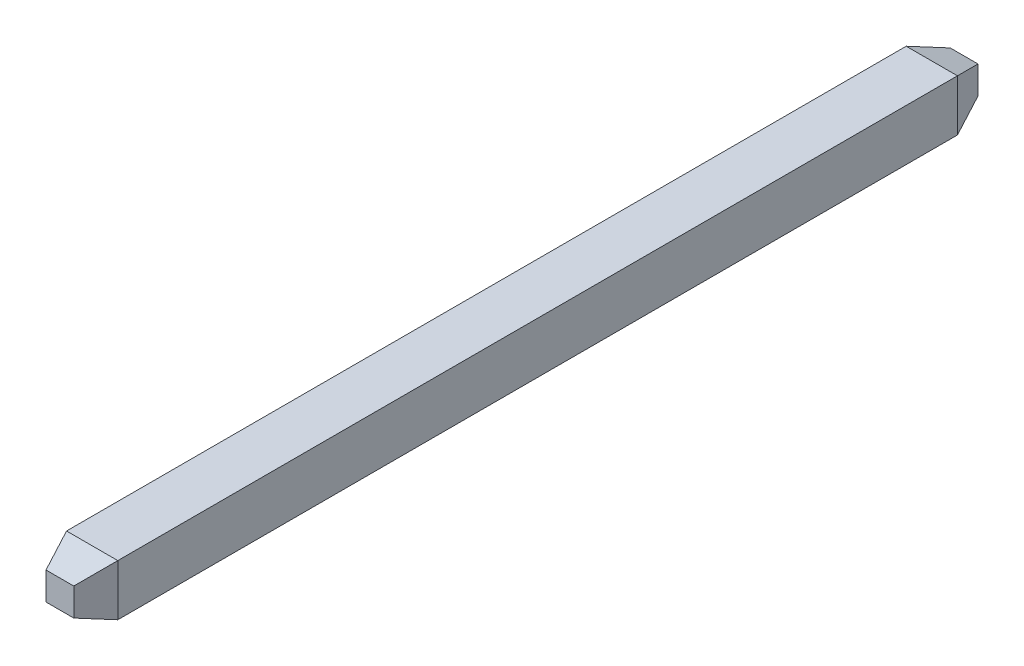
ISO-10303-21;
HEADER;
FILE_DESCRIPTION(('STEP AP214'),'2;1');
FILE_NAME('part.step','',(''),(''),'','','');
FILE_SCHEMA(('AUTOMOTIVE_DESIGN { 1 0 10303 214 1 1 1 1 }'));
ENDSEC;
DATA;
#1=APPLICATION_CONTEXT('core data for automotive mechanical design processes');
#2=APPLICATION_PROTOCOL_DEFINITION('international standard','automotive_design',2000,#1);
#3=PRODUCT_CONTEXT('',#1,'mechanical');
#4=PRODUCT('Part','Part','',(#3));
#5=PRODUCT_RELATED_PRODUCT_CATEGORY('part','',(#4));
#6=PRODUCT_DEFINITION_FORMATION('','',#4);
#7=PRODUCT_DEFINITION_CONTEXT('part definition',#1,'design');
#8=PRODUCT_DEFINITION('design','',#6,#7);
#9=PRODUCT_DEFINITION_SHAPE('','',#8);
#10=(LENGTH_UNIT() NAMED_UNIT(*) SI_UNIT(.MILLI.,.METRE.));
#11=(NAMED_UNIT(*) PLANE_ANGLE_UNIT() SI_UNIT($,.RADIAN.));
#12=(NAMED_UNIT(*) SI_UNIT($,.STERADIAN.) SOLID_ANGLE_UNIT());
#13=UNCERTAINTY_MEASURE_WITH_UNIT(LENGTH_MEASURE(1.E-05),#10,'distance_accuracy_value','');
#14=(GEOMETRIC_REPRESENTATION_CONTEXT(3) GLOBAL_UNCERTAINTY_ASSIGNED_CONTEXT((#13)) GLOBAL_UNIT_ASSIGNED_CONTEXT((#10,
#11,#12)) REPRESENTATION_CONTEXT('',''));
#15=CARTESIAN_POINT('',(0.,0.,0.));
#16=DIRECTION('',(0.,0.,1.));
#17=DIRECTION('',(1.,0.,0.));
#18=AXIS2_PLACEMENT_3D('',#15,#16,#17);
#19=CARTESIAN_POINT('',(0.171911906294,0.3175,2.6));
#20=DIRECTION('',(-0.939692620785813,0.,-0.342020143325932));
#21=DIRECTION('',(-0.342020143325932,0.,0.939692620785813));
#22=AXIS2_PLACEMENT_3D('',#19,#20,#21);
#23=PLANE('',#22);
#24=DIRECTION('',(0.,-1.,0.));
#25=VECTOR('',#24,1.);
#26=CARTESIAN_POINT('',(0.3175,-0.3175,2.2));
#27=LINE('',#26,#25);
#28=CARTESIAN_POINT('',(0.317500000000268,-0.317500000000134,2.20000000000015));
#29=VERTEX_POINT('',#28);
#30=CARTESIAN_POINT('',(0.317500000000268,0.317500000000134,2.20000000000015));
#31=VERTEX_POINT('',#30);
#32=EDGE_CURVE('E117',#29,#31,#27,.F.);
#33=ORIENTED_EDGE('',*,*,#32,.T.);
#34=DIRECTION('',(-0.323615577117339,-0.323615577118532,0.889126490716169));
#35=VECTOR('',#34,1.);
#36=CARTESIAN_POINT('',(0.3175,0.317500000000537,2.2000000000002));
#37=LINE('',#36,#35);
#38=CARTESIAN_POINT('',(0.171911906294,0.171911906294,2.6));
#39=VERTEX_POINT('',#38);
#40=EDGE_CURVE('E88',#31,#39,#37,.T.);
#41=ORIENTED_EDGE('',*,*,#40,.T.);
#42=DIRECTION('',(0.,1.,0.));
#43=VECTOR('',#42,1.);
#44=CARTESIAN_POINT('',(0.171911906294,0.3175,2.6));
#45=LINE('',#44,#43);
#46=CARTESIAN_POINT('',(0.171911906294,-0.171911906294,2.6));
#47=VERTEX_POINT('',#46);
#48=EDGE_CURVE('E19',#39,#47,#45,.F.);
#49=ORIENTED_EDGE('',*,*,#48,.T.);
#50=DIRECTION('',(0.323615577117339,-0.323615577118532,-0.889126490716169));
#51=VECTOR('',#50,1.);
#52=CARTESIAN_POINT('',(0.171911906294,-0.171911906294,2.6));
#53=LINE('',#52,#51);
#54=EDGE_CURVE('E86',#47,#29,#53,.T.);
#55=ORIENTED_EDGE('',*,*,#54,.T.);
#56=EDGE_LOOP('',(#33,#41,#49,#55));
#57=FACE_BOUND('',#56,.T.);
#58=ADVANCED_FACE('F16',(#57),#23,.F.);
#59=CARTESIAN_POINT('',(0.3175,-0.3175,-8.2));
#60=DIRECTION('',(0.939692620785813,0.,-0.342020143325932));
#61=DIRECTION('',(-0.342020143325932,0.,-0.939692620785813));
#62=AXIS2_PLACEMENT_3D('',#59,#60,#61);
#63=PLANE('',#62);
#64=DIRECTION('',(-0.323615577117339,-0.323615577118533,-0.889126490716169));
#65=VECTOR('',#64,1.);
#66=CARTESIAN_POINT('',(0.3175,0.3175,-8.2));
#67=LINE('',#66,#65);
#68=CARTESIAN_POINT('',(0.3175,0.3175,-8.2));
#69=VERTEX_POINT('',#68);
#70=CARTESIAN_POINT('',(0.171911906293732,0.171911906293866,-8.59999999999985));
#71=VERTEX_POINT('',#70);
#72=EDGE_CURVE('E113',#69,#71,#67,.T.);
#73=ORIENTED_EDGE('',*,*,#72,.F.);
#74=DIRECTION('',(0.,-1.,0.));
#75=VECTOR('',#74,1.);
#76=CARTESIAN_POINT('',(0.3175,-0.3175,-8.2));
#77=LINE('',#76,#75);
#78=CARTESIAN_POINT('',(0.3175,-0.3175,-8.2));
#79=VERTEX_POINT('',#78);
#80=EDGE_CURVE('E119',#69,#79,#77,.T.);
#81=ORIENTED_EDGE('',*,*,#80,.T.);
#82=DIRECTION('',(0.323615577117339,-0.323615577118533,0.889126490716169));
#83=VECTOR('',#82,1.);
#84=CARTESIAN_POINT('',(0.171911906294,-0.171911906293463,-8.5999999999998));
#85=LINE('',#84,#83);
#86=CARTESIAN_POINT('',(0.171911906293732,-0.171911906293866,-8.59999999999985));
#87=VERTEX_POINT('',#86);
#88=EDGE_CURVE('E100',#87,#79,#85,.T.);
#89=ORIENTED_EDGE('',*,*,#88,.F.);
#90=DIRECTION('',(0.,1.,0.));
#91=VECTOR('',#90,1.);
#92=CARTESIAN_POINT('',(0.171911906294,0.3175,-8.6));
#93=LINE('',#92,#91);
#94=EDGE_CURVE('E78',#71,#87,#93,.F.);
#95=ORIENTED_EDGE('',*,*,#94,.F.);
#96=EDGE_LOOP('',(#73,#81,#89,#95));
#97=FACE_BOUND('',#96,.T.);
#98=ADVANCED_FACE('F210',(#97),#63,.T.);
#99=CARTESIAN_POINT('',(-0.3175,0.3175,2.6));
#100=DIRECTION('',(0.,0.,-1.));
#101=DIRECTION('',(-1.,0.,0.));
#102=AXIS2_PLACEMENT_3D('',#99,#100,#101);
#103=PLANE('',#102);
#104=ORIENTED_EDGE('',*,*,#48,.F.);
#105=DIRECTION('',(1.,0.,0.));
#106=VECTOR('',#105,1.);
#107=CARTESIAN_POINT('',(-0.3175,0.171911906294,2.6));
#108=LINE('',#107,#106);
#109=CARTESIAN_POINT('',(-0.171911906294,0.171911906294,2.6));
#110=VERTEX_POINT('',#109);
#111=EDGE_CURVE('E111',#39,#110,#108,.F.);
#112=ORIENTED_EDGE('',*,*,#111,.T.);
#113=DIRECTION('',(0.,1.,0.));
#114=VECTOR('',#113,1.);
#115=CARTESIAN_POINT('',(-0.171911906294,0.3175,2.6));
#116=LINE('',#115,#114);
#117=CARTESIAN_POINT('',(-0.171911906294,-0.171911906294,2.6));
#118=VERTEX_POINT('',#117);
#119=EDGE_CURVE('E104',#110,#118,#116,.F.);
#120=ORIENTED_EDGE('',*,*,#119,.T.);
#121=DIRECTION('',(1.,0.,0.));
#122=VECTOR('',#121,1.);
#123=CARTESIAN_POINT('',(-0.3175,-0.171911906294,2.6));
#124=LINE('',#123,#122);
#125=EDGE_CURVE('E93',#118,#47,#124,.T.);
#126=ORIENTED_EDGE('',*,*,#125,.T.);
#127=EDGE_LOOP('',(#104,#112,#120,#126));
#128=FACE_BOUND('',#127,.T.);
#129=ADVANCED_FACE('F103',(#128),#103,.F.);
#130=CARTESIAN_POINT('',(-0.3175,-0.171911906294,2.6));
#131=DIRECTION('',(0.,0.939692620785813,-0.342020143325932));
#132=DIRECTION('',(0.,0.342020143325932,0.939692620785813));
#133=AXIS2_PLACEMENT_3D('',#130,#131,#132);
#134=PLANE('',#133);
#135=DIRECTION('',(1.,0.,0.));
#136=VECTOR('',#135,1.);
#137=CARTESIAN_POINT('',(-0.3175,-0.3175,2.2));
#138=LINE('',#137,#136);
#139=CARTESIAN_POINT('',(-0.317500000000134,-0.317500000000268,2.20000000000015));
#140=VERTEX_POINT('',#139);
#141=EDGE_CURVE('E99',#140,#29,#138,.T.);
#142=ORIENTED_EDGE('',*,*,#141,.T.);
#143=ORIENTED_EDGE('',*,*,#54,.F.);
#144=ORIENTED_EDGE('',*,*,#125,.F.);
#145=DIRECTION('',(-0.323615577118532,-0.323615577117339,-0.889126490716169));
#146=VECTOR('',#145,1.);
#147=CARTESIAN_POINT('',(-0.171911906294,-0.171911906294,2.6));
#148=LINE('',#147,#146);
#149=EDGE_CURVE('E123',#118,#140,#148,.T.);
#150=ORIENTED_EDGE('',*,*,#149,.T.);
#151=EDGE_LOOP('',(#142,#143,#144,#150));
#152=FACE_BOUND('',#151,.T.);
#153=ADVANCED_FACE('F96',(#152),#134,.F.);
#154=CARTESIAN_POINT('',(-0.3175,-0.3175,-8.2));
#155=DIRECTION('',(0.,-0.939692620785813,-0.342020143325932));
#156=DIRECTION('',(0.,0.342020143325932,-0.939692620785813));
#157=AXIS2_PLACEMENT_3D('',#154,#155,#156);
#158=PLANE('',#157);
#159=ORIENTED_EDGE('',*,*,#88,.T.);
#160=DIRECTION('',(1.,0.,0.));
#161=VECTOR('',#160,1.);
#162=CARTESIAN_POINT('',(-0.3175,-0.3175,-8.2));
#163=LINE('',#162,#161);
#164=CARTESIAN_POINT('',(-0.3175,-0.3175,-8.2));
#165=VERTEX_POINT('',#164);
#166=EDGE_CURVE('E132',#79,#165,#163,.F.);
#167=ORIENTED_EDGE('',*,*,#166,.T.);
#168=DIRECTION('',(-0.323615577118533,-0.323615577117339,0.889126490716169));
#169=VECTOR('',#168,1.);
#170=CARTESIAN_POINT('',(-0.171911906293463,-0.171911906294,-8.5999999999998));
#171=LINE('',#170,#169);
#172=CARTESIAN_POINT('',(-0.171911906293866,-0.171911906293732,-8.59999999999985));
#173=VERTEX_POINT('',#172);
#174=EDGE_CURVE('E135',#173,#165,#171,.T.);
#175=ORIENTED_EDGE('',*,*,#174,.F.);
#176=DIRECTION('',(-1.,0.,0.));
#177=VECTOR('',#176,1.);
#178=CARTESIAN_POINT('',(-0.3175,-0.171911906294,-8.6));
#179=LINE('',#178,#177);
#180=EDGE_CURVE('E108',#87,#173,#179,.T.);
#181=ORIENTED_EDGE('',*,*,#180,.F.);
#182=EDGE_LOOP('',(#159,#167,#175,#181));
#183=FACE_BOUND('',#182,.T.);
#184=ADVANCED_FACE('F203',(#183),#158,.T.);
#185=CARTESIAN_POINT('',(-0.3175,0.3175,-8.6));
#186=DIRECTION('',(0.,0.,-1.));
#187=DIRECTION('',(-1.,0.,0.));
#188=AXIS2_PLACEMENT_3D('',#185,#186,#187);
#189=PLANE('',#188);
#190=ORIENTED_EDGE('',*,*,#94,.T.);
#191=ORIENTED_EDGE('',*,*,#180,.T.);
#192=DIRECTION('',(0.,1.,0.));
#193=VECTOR('',#192,1.);
#194=CARTESIAN_POINT('',(-0.171911906293463,-0.3175,-8.5999999999998));
#195=LINE('',#194,#193);
#196=CARTESIAN_POINT('',(-0.171911906293866,0.171911906293732,-8.59999999999985));
#197=VERTEX_POINT('',#196);
#198=EDGE_CURVE('E140',#197,#173,#195,.F.);
#199=ORIENTED_EDGE('',*,*,#198,.F.);
#200=DIRECTION('',(1.,0.,0.));
#201=VECTOR('',#200,1.);
#202=CARTESIAN_POINT('',(-0.3175,0.171911906293463,-8.5999999999998));
#203=LINE('',#202,#201);
#204=EDGE_CURVE('E115',#71,#197,#203,.F.);
#205=ORIENTED_EDGE('',*,*,#204,.F.);
#206=EDGE_LOOP('',(#190,#191,#199,#205));
#207=FACE_BOUND('',#206,.T.);
#208=ADVANCED_FACE('F200',(#207),#189,.T.);
#209=CARTESIAN_POINT('',(-0.3175,0.171911906294,2.6));
#210=DIRECTION('',(0.,-0.939692620785813,-0.342020143325932));
#211=DIRECTION('',(0.,0.342020143325932,-0.939692620785813));
#212=AXIS2_PLACEMENT_3D('',#209,#210,#211);
#213=PLANE('',#212);
#214=ORIENTED_EDGE('',*,*,#111,.F.);
#215=ORIENTED_EDGE('',*,*,#40,.F.);
#216=DIRECTION('',(1.,0.,0.));
#217=VECTOR('',#216,1.);
#218=CARTESIAN_POINT('',(-0.3175,0.3175,2.2));
#219=LINE('',#218,#217);
#220=CARTESIAN_POINT('',(-0.317500000000134,0.317500000000268,2.20000000000015));
#221=VERTEX_POINT('',#220);
#222=EDGE_CURVE('E143',#31,#221,#219,.F.);
#223=ORIENTED_EDGE('',*,*,#222,.T.);
#224=DIRECTION('',(0.323615577118533,-0.32361557711734,0.889126490716169));
#225=VECTOR('',#224,1.);
#226=CARTESIAN_POINT('',(-0.317500000000537,0.3175,2.2000000000002));
#227=LINE('',#226,#225);
#228=EDGE_CURVE('E125',#221,#110,#227,.T.);
#229=ORIENTED_EDGE('',*,*,#228,.T.);
#230=EDGE_LOOP('',(#214,#215,#223,#229));
#231=FACE_BOUND('',#230,.T.);
#232=ADVANCED_FACE('F174',(#231),#213,.F.);
#233=CARTESIAN_POINT('',(-0.3175,0.3175,-8.2));
#234=DIRECTION('',(0.,0.939692620785813,-0.342020143325932));
#235=DIRECTION('',(0.,0.342020143325932,0.939692620785813));
#236=AXIS2_PLACEMENT_3D('',#233,#234,#235);
#237=PLANE('',#236);
#238=DIRECTION('',(0.323615577118533,-0.323615577117339,-0.889126490716169));
#239=VECTOR('',#238,1.);
#240=CARTESIAN_POINT('',(-0.3175,0.3175,-8.2));
#241=LINE('',#240,#239);
#242=CARTESIAN_POINT('',(-0.3175,0.3175,-8.2));
#243=VERTEX_POINT('',#242);
#244=EDGE_CURVE('E137',#243,#197,#241,.T.);
#245=ORIENTED_EDGE('',*,*,#244,.F.);
#246=DIRECTION('',(1.,0.,0.));
#247=VECTOR('',#246,1.);
#248=CARTESIAN_POINT('',(-0.3175,0.3175,-8.2));
#249=LINE('',#248,#247);
#250=EDGE_CURVE('E33',#243,#69,#249,.T.);
#251=ORIENTED_EDGE('',*,*,#250,.T.);
#252=ORIENTED_EDGE('',*,*,#72,.T.);
#253=ORIENTED_EDGE('',*,*,#204,.T.);
#254=EDGE_LOOP('',(#245,#251,#252,#253));
#255=FACE_BOUND('',#254,.T.);
#256=ADVANCED_FACE('F193',(#255),#237,.T.);
#257=CARTESIAN_POINT('',(0.3175,-0.3175,2.6));
#258=DIRECTION('',(-1.,0.,0.));
#259=DIRECTION('',(0.,-1.,0.));
#260=AXIS2_PLACEMENT_3D('',#257,#258,#259);
#261=PLANE('',#260);
#262=ORIENTED_EDGE('',*,*,#80,.F.);
#263=DIRECTION('',(0.,0.,-1.));
#264=VECTOR('',#263,1.);
#265=CARTESIAN_POINT('',(0.3175,0.3175,2.6));
#266=LINE('',#265,#264);
#267=EDGE_CURVE('E147',#69,#31,#266,.F.);
#268=ORIENTED_EDGE('',*,*,#267,.T.);
#269=ORIENTED_EDGE('',*,*,#32,.F.);
#270=DIRECTION('',(0.,0.,1.));
#271=VECTOR('',#270,1.);
#272=CARTESIAN_POINT('',(0.3175,-0.3175,2.6));
#273=LINE('',#272,#271);
#274=EDGE_CURVE('E129',#29,#79,#273,.F.);
#275=ORIENTED_EDGE('',*,*,#274,.T.);
#276=EDGE_LOOP('',(#262,#268,#269,#275));
#277=FACE_BOUND('',#276,.T.);
#278=ADVANCED_FACE('F190',(#277),#261,.F.);
#279=CARTESIAN_POINT('',(-0.171911906294,0.3175,2.6));
#280=DIRECTION('',(0.939692620785813,0.,-0.342020143325932));
#281=DIRECTION('',(-0.342020143325932,0.,-0.939692620785813));
#282=AXIS2_PLACEMENT_3D('',#279,#280,#281);
#283=PLANE('',#282);
#284=DIRECTION('',(0.,1.,0.));
#285=VECTOR('',#284,1.);
#286=CARTESIAN_POINT('',(-0.3175,-0.3175,2.2));
#287=LINE('',#286,#285);
#288=EDGE_CURVE('E150',#221,#140,#287,.F.);
#289=ORIENTED_EDGE('',*,*,#288,.T.);
#290=ORIENTED_EDGE('',*,*,#149,.F.);
#291=ORIENTED_EDGE('',*,*,#119,.F.);
#292=ORIENTED_EDGE('',*,*,#228,.F.);
#293=EDGE_LOOP('',(#289,#290,#291,#292));
#294=FACE_BOUND('',#293,.T.);
#295=ADVANCED_FACE('F171',(#294),#283,.F.);
#296=CARTESIAN_POINT('',(-0.3175,-0.3175,2.6));
#297=DIRECTION('',(0.,1.,0.));
#298=DIRECTION('',(0.,0.,1.));
#299=AXIS2_PLACEMENT_3D('',#296,#297,#298);
#300=PLANE('',#299);
#301=ORIENTED_EDGE('',*,*,#166,.F.);
#302=ORIENTED_EDGE('',*,*,#274,.F.);
#303=ORIENTED_EDGE('',*,*,#141,.F.);
#304=DIRECTION('',(0.,0.,1.));
#305=VECTOR('',#304,1.);
#306=CARTESIAN_POINT('',(-0.3175,-0.3175,2.6));
#307=LINE('',#306,#305);
#308=EDGE_CURVE('E153',#140,#165,#307,.F.);
#309=ORIENTED_EDGE('',*,*,#308,.T.);
#310=EDGE_LOOP('',(#301,#302,#303,#309));
#311=FACE_BOUND('',#310,.T.);
#312=ADVANCED_FACE('F169',(#311),#300,.F.);
#313=CARTESIAN_POINT('',(-0.3175,-0.3175,-8.2));
#314=DIRECTION('',(-0.939692620785813,0.,-0.342020143325932));
#315=DIRECTION('',(-0.342020143325932,0.,0.939692620785813));
#316=AXIS2_PLACEMENT_3D('',#313,#314,#315);
#317=PLANE('',#316);
#318=ORIENTED_EDGE('',*,*,#244,.T.);
#319=ORIENTED_EDGE('',*,*,#198,.T.);
#320=ORIENTED_EDGE('',*,*,#174,.T.);
#321=DIRECTION('',(0.,1.,0.));
#322=VECTOR('',#321,1.);
#323=CARTESIAN_POINT('',(-0.3175,-0.3175,-8.2));
#324=LINE('',#323,#322);
#325=EDGE_CURVE('E25',#165,#243,#324,.T.);
#326=ORIENTED_EDGE('',*,*,#325,.T.);
#327=EDGE_LOOP('',(#318,#319,#320,#326));
#328=FACE_BOUND('',#327,.T.);
#329=ADVANCED_FACE('F159',(#328),#317,.T.);
#330=CARTESIAN_POINT('',(-0.3175,0.3175,2.6));
#331=DIRECTION('',(0.,-1.,0.));
#332=DIRECTION('',(0.,0.,-1.));
#333=AXIS2_PLACEMENT_3D('',#330,#331,#332);
#334=PLANE('',#333);
#335=ORIENTED_EDGE('',*,*,#250,.F.);
#336=DIRECTION('',(0.,0.,1.));
#337=VECTOR('',#336,1.);
#338=CARTESIAN_POINT('',(-0.3175,0.3175,2.6));
#339=LINE('',#338,#337);
#340=EDGE_CURVE('E11',#243,#221,#339,.T.);
#341=ORIENTED_EDGE('',*,*,#340,.T.);
#342=ORIENTED_EDGE('',*,*,#222,.F.);
#343=ORIENTED_EDGE('',*,*,#267,.F.);
#344=EDGE_LOOP('',(#335,#341,#342,#343));
#345=FACE_BOUND('',#344,.T.);
#346=ADVANCED_FACE('F175',(#345),#334,.F.);
#347=CARTESIAN_POINT('',(-0.3175,-0.3175,2.6));
#348=DIRECTION('',(1.,0.,0.));
#349=DIRECTION('',(0.,1.,0.));
#350=AXIS2_PLACEMENT_3D('',#347,#348,#349);
#351=PLANE('',#350);
#352=ORIENTED_EDGE('',*,*,#325,.F.);
#353=ORIENTED_EDGE('',*,*,#308,.F.);
#354=ORIENTED_EDGE('',*,*,#288,.F.);
#355=ORIENTED_EDGE('',*,*,#340,.F.);
#356=EDGE_LOOP('',(#352,#353,#354,#355));
#357=FACE_BOUND('',#356,.T.);
#358=ADVANCED_FACE('F165',(#357),#351,.F.);
#359=CLOSED_SHELL('',(#58,#98,#129,#153,#184,#208,#232,#256,#278,#295,#312,#329,#346,#358));
#360=MANIFOLD_SOLID_BREP('B1',#359);
#361=ADVANCED_BREP_SHAPE_REPRESENTATION('',(#18,#360),#14);
#362=SHAPE_DEFINITION_REPRESENTATION(#9,#361);
ENDSEC;
END-ISO-10303-21;
